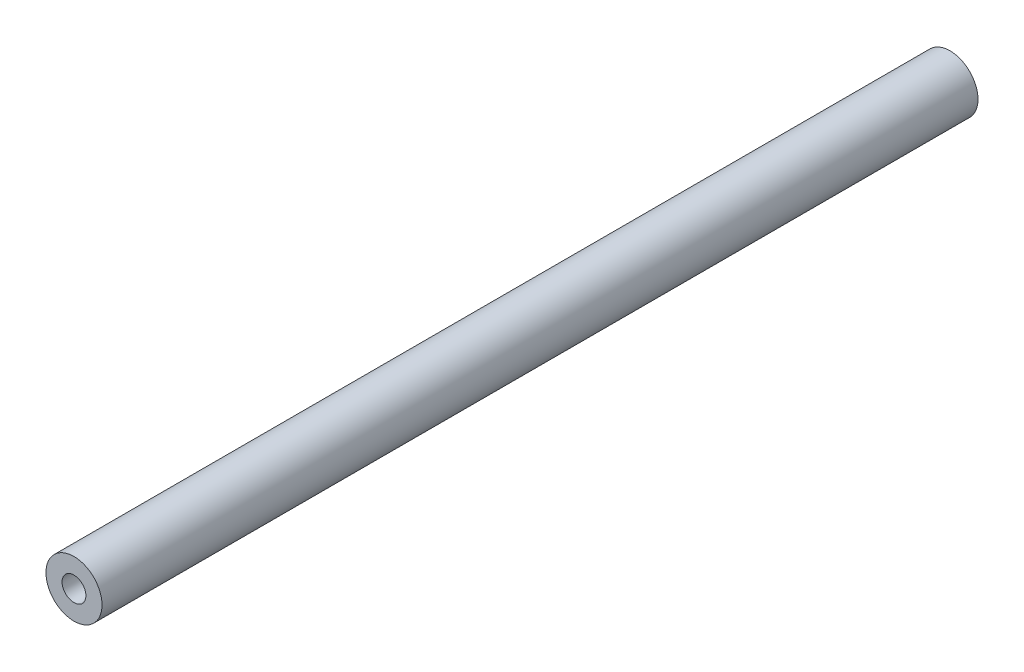
ISO-10303-21;
HEADER;
FILE_DESCRIPTION(('STEP AP214'),'2;1');
FILE_NAME('part.step','',(''),(''),'','','');
FILE_SCHEMA(('AUTOMOTIVE_DESIGN { 1 0 10303 214 1 1 1 1 }'));
ENDSEC;
DATA;
#1=APPLICATION_CONTEXT('core data for automotive mechanical design processes');
#2=APPLICATION_PROTOCOL_DEFINITION('international standard','automotive_design',2000,#1);
#3=PRODUCT_CONTEXT('',#1,'mechanical');
#4=PRODUCT('Part','Part','',(#3));
#5=PRODUCT_RELATED_PRODUCT_CATEGORY('part','',(#4));
#6=PRODUCT_DEFINITION_FORMATION('','',#4);
#7=PRODUCT_DEFINITION_CONTEXT('part definition',#1,'design');
#8=PRODUCT_DEFINITION('design','',#6,#7);
#9=PRODUCT_DEFINITION_SHAPE('','',#8);
#10=(LENGTH_UNIT() NAMED_UNIT(*) SI_UNIT(.MILLI.,.METRE.));
#11=(NAMED_UNIT(*) PLANE_ANGLE_UNIT() SI_UNIT($,.RADIAN.));
#12=(NAMED_UNIT(*) SI_UNIT($,.STERADIAN.) SOLID_ANGLE_UNIT());
#13=UNCERTAINTY_MEASURE_WITH_UNIT(LENGTH_MEASURE(1.E-05),#10,'distance_accuracy_value','');
#14=(GEOMETRIC_REPRESENTATION_CONTEXT(3) GLOBAL_UNCERTAINTY_ASSIGNED_CONTEXT((#13)) GLOBAL_UNIT_ASSIGNED_CONTEXT((#10,
#11,#12)) REPRESENTATION_CONTEXT('',''));
#15=CARTESIAN_POINT('',(0.,0.,0.));
#16=DIRECTION('',(0.,0.,1.));
#17=DIRECTION('',(1.,0.,0.));
#18=AXIS2_PLACEMENT_3D('',#15,#16,#17);
#19=CARTESIAN_POINT('',(0.,0.,250.));
#20=DIRECTION('',(0.,0.,-1.));
#21=DIRECTION('',(-1.,0.,0.));
#22=AXIS2_PLACEMENT_3D('',#19,#20,#21);
#23=CYLINDRICAL_SURFACE('',#22,8.);
#24=CARTESIAN_POINT('',(0.,0.,250.));
#25=DIRECTION('',(0.,0.,1.));
#26=DIRECTION('',(1.,0.,0.));
#27=AXIS2_PLACEMENT_3D('',#24,#25,#26);
#28=CIRCLE('',#27,8.);
#29=CARTESIAN_POINT('',(8.,0.,250.));
#30=VERTEX_POINT('',#29);
#31=EDGE_CURVE('E11',#30,#30,#28,.T.);
#32=ORIENTED_EDGE('',*,*,#31,.F.);
#33=EDGE_LOOP('',(#32));
#34=FACE_BOUND('',#33,.T.);
#35=CARTESIAN_POINT('',(0.,0.,0.));
#36=DIRECTION('',(0.,0.,1.));
#37=DIRECTION('',(1.,0.,0.));
#38=AXIS2_PLACEMENT_3D('',#35,#36,#37);
#39=CIRCLE('',#38,8.);
#40=CARTESIAN_POINT('',(8.,0.,0.));
#41=VERTEX_POINT('',#40);
#42=EDGE_CURVE('E40',#41,#41,#39,.T.);
#43=ORIENTED_EDGE('',*,*,#42,.T.);
#44=EDGE_LOOP('',(#43));
#45=FACE_BOUND('',#44,.T.);
#46=ADVANCED_FACE('F37',(#34,#45),#23,.T.);
#47=CARTESIAN_POINT('',(0.,0.,250.));
#48=DIRECTION('',(0.,0.,1.));
#49=DIRECTION('',(1.,0.,0.));
#50=AXIS2_PLACEMENT_3D('',#47,#48,#49);
#51=PLANE('',#50);
#52=CARTESIAN_POINT('',(0.,0.,250.));
#53=DIRECTION('',(0.,0.,1.));
#54=DIRECTION('',(1.,0.,0.));
#55=AXIS2_PLACEMENT_3D('',#52,#53,#54);
#56=CIRCLE('',#55,3.39999999999999);
#57=CARTESIAN_POINT('',(3.39999999999999,0.,250.));
#58=VERTEX_POINT('',#57);
#59=EDGE_CURVE('E60',#58,#58,#56,.T.);
#60=ORIENTED_EDGE('',*,*,#59,.F.);
#61=EDGE_LOOP('',(#60));
#62=FACE_BOUND('',#61,.T.);
#63=ORIENTED_EDGE('',*,*,#31,.T.);
#64=EDGE_LOOP('',(#63));
#65=FACE_BOUND('',#64,.T.);
#66=ADVANCED_FACE('F79',(#62,#65),#51,.T.);
#67=CARTESIAN_POINT('',(0.,0.,0.));
#68=DIRECTION('',(0.,0.,1.));
#69=DIRECTION('',(1.,0.,0.));
#70=AXIS2_PLACEMENT_3D('',#67,#68,#69);
#71=PLANE('',#70);
#72=CARTESIAN_POINT('',(0.,0.,0.));
#73=DIRECTION('',(0.,0.,-1.));
#74=DIRECTION('',(-1.,0.,0.));
#75=AXIS2_PLACEMENT_3D('',#72,#73,#74);
#76=CIRCLE('',#75,3.39999999999999);
#77=CARTESIAN_POINT('',(-3.39999999999999,0.,0.));
#78=VERTEX_POINT('',#77);
#79=EDGE_CURVE('E61',#78,#78,#76,.T.);
#80=ORIENTED_EDGE('',*,*,#79,.F.);
#81=EDGE_LOOP('',(#80));
#82=FACE_BOUND('',#81,.T.);
#83=ORIENTED_EDGE('',*,*,#42,.F.);
#84=EDGE_LOOP('',(#83));
#85=FACE_BOUND('',#84,.T.);
#86=ADVANCED_FACE('F76',(#82,#85),#71,.F.);
#87=CARTESIAN_POINT('',(0.,0.,223.75));
#88=DIRECTION('',(0.,0.,1.));
#89=DIRECTION('',(1.,0.,0.));
#90=AXIS2_PLACEMENT_3D('',#87,#88,#89);
#91=CONICAL_SURFACE('',#90,3.39999999999999,1.02974425867665);
#92=CARTESIAN_POINT('',(0.,0.,221.707073895306));
#93=VERTEX_POINT('',#92);
#94=VERTEX_LOOP('',#93);
#95=FACE_BOUND('',#94,.T.);
#96=CARTESIAN_POINT('',(0.,0.,223.75));
#97=DIRECTION('',(0.,0.,1.));
#98=DIRECTION('',(1.,0.,0.));
#99=AXIS2_PLACEMENT_3D('',#96,#97,#98);
#100=CIRCLE('',#99,3.39999999999999);
#101=CARTESIAN_POINT('',(3.39999999999999,0.,223.75));
#102=VERTEX_POINT('',#101);
#103=EDGE_CURVE('E64',#102,#102,#100,.T.);
#104=ORIENTED_EDGE('',*,*,#103,.T.);
#105=EDGE_LOOP('',(#104));
#106=FACE_BOUND('',#105,.T.);
#107=ADVANCED_FACE('F78',(#95,#106),#91,.F.);
#108=CARTESIAN_POINT('',(0.,0.,250.));
#109=DIRECTION('',(0.,0.,1.));
#110=DIRECTION('',(1.,0.,0.));
#111=AXIS2_PLACEMENT_3D('',#108,#109,#110);
#112=CYLINDRICAL_SURFACE('',#111,3.39999999999999);
#113=ORIENTED_EDGE('',*,*,#103,.F.);
#114=EDGE_LOOP('',(#113));
#115=FACE_BOUND('',#114,.T.);
#116=ORIENTED_EDGE('',*,*,#59,.T.);
#117=EDGE_LOOP('',(#116));
#118=FACE_BOUND('',#117,.T.);
#119=ADVANCED_FACE('F54',(#115,#118),#112,.F.);
#120=CARTESIAN_POINT('',(0.,0.,26.25));
#121=DIRECTION('',(0.,0.,-1.));
#122=DIRECTION('',(-1.,0.,0.));
#123=AXIS2_PLACEMENT_3D('',#120,#121,#122);
#124=CONICAL_SURFACE('',#123,3.39999999999999,1.02974425867665);
#125=CARTESIAN_POINT('',(0.,0.,28.2929261046937));
#126=VERTEX_POINT('',#125);
#127=VERTEX_LOOP('',#126);
#128=FACE_BOUND('',#127,.T.);
#129=CARTESIAN_POINT('',(0.,0.,26.25));
#130=DIRECTION('',(0.,0.,-1.));
#131=DIRECTION('',(-1.,0.,0.));
#132=AXIS2_PLACEMENT_3D('',#129,#130,#131);
#133=CIRCLE('',#132,3.39999999999999);
#134=CARTESIAN_POINT('',(-3.39999999999999,0.,26.25));
#135=VERTEX_POINT('',#134);
#136=EDGE_CURVE('E58',#135,#135,#133,.T.);
#137=ORIENTED_EDGE('',*,*,#136,.T.);
#138=EDGE_LOOP('',(#137));
#139=FACE_BOUND('',#138,.T.);
#140=ADVANCED_FACE('F50',(#128,#139),#124,.F.);
#141=CARTESIAN_POINT('',(0.,0.,0.));
#142=DIRECTION('',(0.,0.,-1.));
#143=DIRECTION('',(-1.,0.,0.));
#144=AXIS2_PLACEMENT_3D('',#141,#142,#143);
#145=CYLINDRICAL_SURFACE('',#144,3.39999999999999);
#146=ORIENTED_EDGE('',*,*,#136,.F.);
#147=EDGE_LOOP('',(#146));
#148=FACE_BOUND('',#147,.T.);
#149=ORIENTED_EDGE('',*,*,#79,.T.);
#150=EDGE_LOOP('',(#149));
#151=FACE_BOUND('',#150,.T.);
#152=ADVANCED_FACE('F53',(#148,#151),#145,.F.);
#153=CLOSED_SHELL('',(#46,#66,#86,#107,#119,#140,#152));
#154=MANIFOLD_SOLID_BREP('B2',#153);
#155=ADVANCED_BREP_SHAPE_REPRESENTATION('',(#18,#154),#14);
#156=SHAPE_DEFINITION_REPRESENTATION(#9,#155);
ENDSEC;
END-ISO-10303-21;
